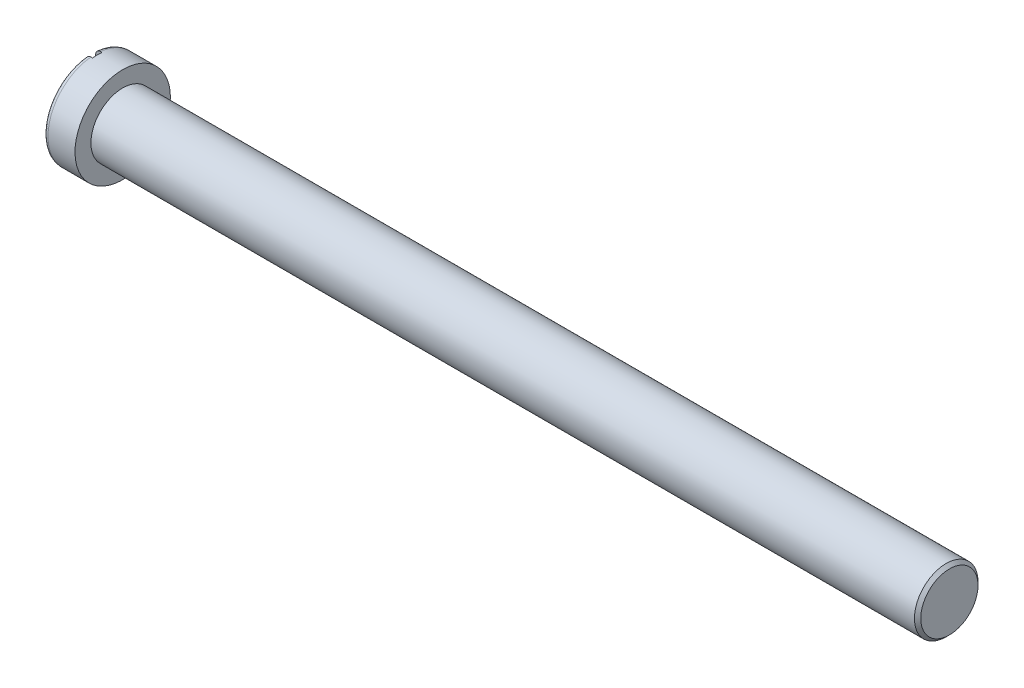
ISO-10303-21;
HEADER;
FILE_DESCRIPTION(('STEP AP214'),'2;1');
FILE_NAME('part.step','',(''),(''),'','','');
FILE_SCHEMA(('AUTOMOTIVE_DESIGN { 1 0 10303 214 1 1 1 1 }'));
ENDSEC;
DATA;
#1=APPLICATION_CONTEXT('core data for automotive mechanical design processes');
#2=APPLICATION_PROTOCOL_DEFINITION('international standard','automotive_design',2000,#1);
#3=PRODUCT_CONTEXT('',#1,'mechanical');
#4=PRODUCT('Part','Part','',(#3));
#5=PRODUCT_RELATED_PRODUCT_CATEGORY('part','',(#4));
#6=PRODUCT_DEFINITION_FORMATION('','',#4);
#7=PRODUCT_DEFINITION_CONTEXT('part definition',#1,'design');
#8=PRODUCT_DEFINITION('design','',#6,#7);
#9=PRODUCT_DEFINITION_SHAPE('','',#8);
#10=(LENGTH_UNIT() NAMED_UNIT(*) SI_UNIT(.MILLI.,.METRE.));
#11=(NAMED_UNIT(*) PLANE_ANGLE_UNIT() SI_UNIT($,.RADIAN.));
#12=(NAMED_UNIT(*) SI_UNIT($,.STERADIAN.) SOLID_ANGLE_UNIT());
#13=UNCERTAINTY_MEASURE_WITH_UNIT(LENGTH_MEASURE(1.E-05),#10,'distance_accuracy_value','');
#14=(GEOMETRIC_REPRESENTATION_CONTEXT(3) GLOBAL_UNCERTAINTY_ASSIGNED_CONTEXT((#13)) GLOBAL_UNIT_ASSIGNED_CONTEXT((#10,
#11,#12)) REPRESENTATION_CONTEXT('',''));
#15=CARTESIAN_POINT('',(0.,0.,0.));
#16=DIRECTION('',(0.,0.,1.));
#17=DIRECTION('',(1.,0.,0.));
#18=AXIS2_PLACEMENT_3D('',#15,#16,#17);
#19=CARTESIAN_POINT('',(0.,0.,0.));
#20=DIRECTION('',(1.,0.,0.));
#21=DIRECTION('',(0.,0.,-1.));
#22=AXIS2_PLACEMENT_3D('',#19,#20,#21);
#23=PLANE('',#22);
#24=CARTESIAN_POINT('',(0.,0.,0.));
#25=DIRECTION('',(1.,0.,0.));
#26=DIRECTION('',(0.,0.,-1.));
#27=AXIS2_PLACEMENT_3D('',#24,#25,#26);
#28=CIRCLE('',#27,13.5);
#29=CARTESIAN_POINT('',(0.,-13.4164078649987,1.5));
#30=VERTEX_POINT('',#29);
#31=CARTESIAN_POINT('',(0.,13.4164078649987,1.5));
#32=VERTEX_POINT('',#31);
#33=EDGE_CURVE('E100',#30,#32,#28,.F.);
#34=ORIENTED_EDGE('',*,*,#33,.T.);
#35=DIRECTION('',(0.,1.,0.));
#36=VECTOR('',#35,1.);
#37=CARTESIAN_POINT('',(0.,16.2746673821269,1.5));
#38=LINE('',#37,#36);
#39=EDGE_CURVE('E91',#30,#32,#38,.T.);
#40=ORIENTED_EDGE('',*,*,#39,.F.);
#41=EDGE_LOOP('',(#34,#40));
#42=FACE_BOUND('',#41,.T.);
#43=ADVANCED_FACE('F36',(#42),#23,.F.);
#44=CARTESIAN_POINT('',(1.5,0.,0.));
#45=DIRECTION('',(1.,0.,0.));
#46=DIRECTION('',(0.,0.,-1.));
#47=AXIS2_PLACEMENT_3D('',#44,#45,#46);
#48=TOROIDAL_SURFACE('',#47,13.5,1.5);
#49=CARTESIAN_POINT('',(0.658761657110633,-14.6653893429134,1.5));
#50=CARTESIAN_POINT('',(0.588881950075341,-14.6178026250305,1.5));
#51=CARTESIAN_POINT('',(0.522984597750688,-14.5642549943853,1.5));
#52=CARTESIAN_POINT('',(0.401076928482061,-14.446795651112,1.5));
#53=CARTESIAN_POINT('',(0.345079184117682,-14.3828709542763,1.5));
#54=CARTESIAN_POINT('',(0.244632342060913,-14.246577084176,1.5));
#55=CARTESIAN_POINT('',(0.200175115110685,-14.17421390742,1.5));
#56=CARTESIAN_POINT('',(0.12399887001359,-14.0230949355003,1.5));
#57=CARTESIAN_POINT('',(0.0922767156007468,-13.9443407200079,1.5));
#58=CARTESIAN_POINT('',(0.0423104345262116,-13.7823199551055,1.5));
#59=CARTESIAN_POINT('',(0.024120943644333,-13.6990365553484,1.5));
#60=CARTESIAN_POINT('',(0.00191683853748084,-13.5305974576376,1.5));
#61=CARTESIAN_POINT('',(-0.00209682620864541,-13.4454416346557,1.5));
#62=CARTESIAN_POINT('',(0.00416504746139457,-13.2752987289487,1.5));
#63=CARTESIAN_POINT('',(0.0145004920128933,-13.1903138460268,1.5));
#64=CARTESIAN_POINT('',(0.0492760978027703,-13.0232795750513,1.5));
#65=CARTESIAN_POINT('',(0.0737164198633457,-12.9412302204797,1.5));
#66=CARTESIAN_POINT('',(0.13605769342508,-12.7823167671011,1.5));
#67=CARTESIAN_POINT('',(0.173972331562082,-12.7054580355235,1.5));
#68=CARTESIAN_POINT('',(0.262207220655774,-12.5592242512426,1.5));
#69=CARTESIAN_POINT('',(0.312527308092724,-12.4898490999134,1.5));
#70=CARTESIAN_POINT('',(0.423984319588116,-12.3608106529017,1.5));
#71=CARTESIAN_POINT('',(0.485085138625724,-12.3011161785888,1.5));
#72=CARTESIAN_POINT('',(0.616500240274044,-12.1929155651438,1.5));
#73=CARTESIAN_POINT('',(0.686814205614405,-12.1444090408943,1.5));
#74=CARTESIAN_POINT('',(0.834160640461374,-12.0603116375499,1.5));
#75=CARTESIAN_POINT('',(0.911145182611494,-12.0246367903474,1.5));
#76=CARTESIAN_POINT('',(1.07003843685694,-11.9668200197288,1.5));
#77=CARTESIAN_POINT('',(1.15194693709275,-11.9446775145238,1.5));
#78=CARTESIAN_POINT('',(1.31776100635549,-11.9146971500425,1.5));
#79=CARTESIAN_POINT('',(1.40164907215188,-11.9067624329036,1.5));
#80=CARTESIAN_POINT('',(1.56956190315916,-11.9051385965254,1.5));
#81=CARTESIAN_POINT('',(1.65358666499348,-11.9114491305905,1.5));
#82=CARTESIAN_POINT('',(1.81911202649103,-11.9380831725712,1.5));
#83=CARTESIAN_POINT('',(1.90061972383106,-11.9583626157128,1.5));
#84=CARTESIAN_POINT('',(2.05908617805528,-12.0122852588638,1.5));
#85=CARTESIAN_POINT('',(2.13604490335928,-12.0459285516361,1.5));
#86=CARTESIAN_POINT('',(2.28344255560767,-12.1256886135582,1.5));
#87=CARTESIAN_POINT('',(2.35386513049815,-12.1718355919212,1.5));
#88=CARTESIAN_POINT('',(2.48602837520643,-12.2752257981684,1.5));
#89=CARTESIAN_POINT('',(2.54776876583923,-12.3324693827353,1.5));
#90=CARTESIAN_POINT('',(2.66124847585957,-12.456822263191,1.5));
#91=CARTESIAN_POINT('',(2.7129200476245,-12.5239933792009,1.5));
#92=CARTESIAN_POINT('',(2.80434502440279,-12.6660078407253,1.5));
#93=CARTESIAN_POINT('',(2.84409797148056,-12.7408514808839,1.5));
#94=CARTESIAN_POINT('',(2.91083598100987,-12.8966440789083,1.5));
#95=CARTESIAN_POINT('',(2.9377309367866,-12.9776316442004,1.5));
#96=CARTESIAN_POINT('',(2.97760323050339,-13.1429638178419,1.5));
#97=CARTESIAN_POINT('',(2.9905801985925,-13.2273085153407,1.5));
#98=CARTESIAN_POINT('',(3.00227734204711,-13.3973172008241,1.5));
#99=CARTESIAN_POINT('',(3.00094101353135,-13.4829850834303,1.5));
#100=CARTESIAN_POINT('',(2.98390101056976,-13.6528808119779,1.5));
#101=CARTESIAN_POINT('',(2.96819729524074,-13.737108653821,1.5));
#102=CARTESIAN_POINT('',(2.92285271426361,-13.9016963670216,1.5));
#103=CARTESIAN_POINT('',(2.89321655149946,-13.9820575334893,1.5));
#104=CARTESIAN_POINT('',(2.82082268209457,-14.1366360146808,1.5));
#105=CARTESIAN_POINT('',(2.77806516980442,-14.2108534203839,1.5));
#106=CARTESIAN_POINT('',(2.68080843369073,-14.350727659402,1.5));
#107=CARTESIAN_POINT('',(2.62635472039642,-14.4164161331203,1.5));
#108=CARTESIAN_POINT('',(2.5071383499482,-14.5376575848534,1.5));
#109=CARTESIAN_POINT('',(2.44237596014139,-14.5932108256372,1.5));
#110=CARTESIAN_POINT('',(2.30474919481204,-14.6922912743553,1.5));
#111=CARTESIAN_POINT('',(2.23192961851644,-14.7358807112105,1.5));
#112=CARTESIAN_POINT('',(2.07998240725951,-14.810146311361,1.5));
#113=CARTESIAN_POINT('',(2.00085519646259,-14.8408233420967,1.5));
#114=CARTESIAN_POINT('',(1.8389477949111,-14.8882505601209,1.5));
#115=CARTESIAN_POINT('',(1.75618707464182,-14.9050672386618,1.5));
#116=CARTESIAN_POINT('',(1.58899314558215,-14.9245310375368,1.5));
#117=CARTESIAN_POINT('',(1.50455955115278,-14.9271748516142,1.5));
#118=CARTESIAN_POINT('',(1.3366357807586,-14.9182209694009,1.5));
#119=CARTESIAN_POINT('',(1.25314401142346,-14.9066527964598,1.5));
#120=CARTESIAN_POINT('',(1.08936107345172,-14.8696654279596,1.5));
#121=CARTESIAN_POINT('',(1.00906612969114,-14.844263123138,1.5));
#122=CARTESIAN_POINT('',(0.883668167759655,-14.7926519647947,1.5));
#123=CARTESIAN_POINT('',(0.83686302706175,-14.7704767176594,1.5));
#124=CARTESIAN_POINT('',(0.745795187066769,-14.7214084521374,1.5));
#125=CARTESIAN_POINT('',(0.701532483496852,-14.6945154416796,1.5));
#126=CARTESIAN_POINT('',(0.658761657110633,-14.6653893429134,1.5));
#127=B_SPLINE_CURVE_WITH_KNOTS('',3,(#49,#50,#51,#52,#53,#54,#55,#56,#57,#58,#59,#60,#61,#62,
#63,#64,#65,#66,#67,#68,#69,#70,#71,#72,#73,#74,#75,#76,#77,#78,#79,#80,#81,#82,#83,#84,#85,#86,
#87,#88,#89,#90,#91,#92,#93,#94,#95,#96,#97,#98,#99,#100,#101,#102,#103,#104,#105,#106,#107,
#108,#109,#110,#111,#112,#113,#114,#115,#116,#117,#118,#119,#120,#121,#122,#123,#124,#125,#126),
.UNSPECIFIED.,.T.,.F.,(4,2,2,2,2,2,2,2,2,2,2,2,2,2,2,2,2,2,2,2,2,2,2,2,2,2,2,2,2,2,2,2,2,2,2,2,
2,2,4),(0.,0.253441528559013,0.507202653017029,0.76078453750335,1.01430393402001,
1.26884139792486,1.52339591010279,1.77901636426818,2.03463973304627,2.29052349878496,
2.54640389182759,2.80144305906708,3.05647344590647,3.30980322165966,3.56312210536949,
3.81470738268159,4.06628653706881,4.31707570038572,4.56786660454331,4.81926891345916,
5.07067930463989,5.32372693786954,5.57678429241107,5.83158994005511,6.08640235863292,
6.34222105693691,6.59804048318961,6.85377361977961,7.10950296868849,7.36425472678598,
7.61899987918088,7.87239373656145,8.12577056852079,8.37792470087382,8.63013765337704,
8.88182755468883,9.13321084274947,9.28833344264498,9.44345578183254),.UNSPECIFIED.);
#128=CARTESIAN_POINT('',(1.5,-14.9248115565993,1.5));
#129=VERTEX_POINT('',#128);
#130=EDGE_CURVE('E88',#129,#30,#127,.T.);
#131=ORIENTED_EDGE('',*,*,#130,.F.);
#132=CARTESIAN_POINT('',(1.5,0.,0.));
#133=DIRECTION('',(1.,0.,0.));
#134=DIRECTION('',(0.,0.,-1.));
#135=AXIS2_PLACEMENT_3D('',#132,#133,#134);
#136=CIRCLE('',#135,15.);
#137=CARTESIAN_POINT('',(1.5,14.9248115565993,1.5));
#138=VERTEX_POINT('',#137);
#139=EDGE_CURVE('E110',#138,#129,#136,.T.);
#140=ORIENTED_EDGE('',*,*,#139,.F.);
#141=CARTESIAN_POINT('',(0.89208507766852,12.0355962922635,1.5));
#142=CARTESIAN_POINT('',(0.815014890465412,12.0700313096894,1.5));
#143=CARTESIAN_POINT('',(0.740810542502947,12.1110372439416,1.5));
#144=CARTESIAN_POINT('',(0.600295645227888,12.2049842717177,1.5));
#145=CARTESIAN_POINT('',(0.533995327214941,12.257940583346,1.5));
#146=CARTESIAN_POINT('',(0.411256492018765,12.3741776563161,1.5));
#147=CARTESIAN_POINT('',(0.354810250281672,12.4374502548437,1.5));
#148=CARTESIAN_POINT('',(0.253291482478019,12.5725120915492,1.5));
#149=CARTESIAN_POINT('',(0.20821617909033,12.6442992437605,1.5));
#150=CARTESIAN_POINT('',(0.1304378187704,12.7947747980929,1.5));
#151=CARTESIAN_POINT('',(0.0978018332667412,12.8734978713372,1.5));
#152=CARTESIAN_POINT('',(0.0461361819431869,13.0352929426433,1.5));
#153=CARTESIAN_POINT('',(0.0271074653083362,13.1183652436551,1.5));
#154=CARTESIAN_POINT('',(0.00312600371542954,13.2869232678526,1.5));
#155=CARTESIAN_POINT('',(-0.00175917646988912,13.3724186117245,1.5));
#156=CARTESIAN_POINT('',(0.00288308461369389,13.5430179649898,1.5));
#157=CARTESIAN_POINT('',(0.01241063191892,13.6281219714994,1.5));
#158=CARTESIAN_POINT('',(0.0456370896693509,13.7955705240068,1.5));
#159=CARTESIAN_POINT('',(0.0693442746278495,13.8779134291139,1.5));
#160=CARTESIAN_POINT('',(0.13029033402662,14.0374302350894,1.5));
#161=CARTESIAN_POINT('',(0.167529006826756,14.1146042129625,1.5));
#162=CARTESIAN_POINT('',(0.254364534386661,14.2613201550759,1.5));
#163=CARTESIAN_POINT('',(0.303921288605928,14.3308858495336,1.5));
#164=CARTESIAN_POINT('',(0.414066989789804,14.460654493929,1.5));
#165=CARTESIAN_POINT('',(0.474655657716305,14.5208576806079,1.5));
#166=CARTESIAN_POINT('',(0.604809592743308,14.6298580262961,1.5));
#167=CARTESIAN_POINT('',(0.6743266711274,14.6787127251941,1.5));
#168=CARTESIAN_POINT('',(0.820609294130074,14.7639885935677,1.5));
#169=CARTESIAN_POINT('',(0.897374628707282,14.8004101231931,1.5));
#170=CARTESIAN_POINT('',(1.05556051447166,14.8596005647775,1.5));
#171=CARTESIAN_POINT('',(1.13695583040908,14.8824369273736,1.5));
#172=CARTESIAN_POINT('',(1.30242981081702,14.9140726044092,1.5));
#173=CARTESIAN_POINT('',(1.38650842022669,14.9228722066927,1.5));
#174=CARTESIAN_POINT('',(1.55468259415372,14.9261715420581,1.5));
#175=CARTESIAN_POINT('',(1.63877728995691,14.9207157355694,1.5));
#176=CARTESIAN_POINT('',(1.80485509279348,14.8957581040442,1.5));
#177=CARTESIAN_POINT('',(1.88683821389806,14.8762563726325,1.5));
#178=CARTESIAN_POINT('',(2.04634628194513,14.8237825486784,1.5));
#179=CARTESIAN_POINT('',(2.12387250775984,14.7908143424686,1.5));
#180=CARTESIAN_POINT('',(2.27230936595073,14.7123628899572,1.5));
#181=CARTESIAN_POINT('',(2.34321993748057,14.6668795285648,1.5));
#182=CARTESIAN_POINT('',(2.47661836343001,14.5645723101346,1.5));
#183=CARTESIAN_POINT('',(2.53908377157139,14.5077191895758,1.5));
#184=CARTESIAN_POINT('',(2.65363791460733,14.3843769269927,1.5));
#185=CARTESIAN_POINT('',(2.70572641810588,14.3178875701458,1.5));
#186=CARTESIAN_POINT('',(2.79831500036371,14.1768272210736,1.5));
#187=CARTESIAN_POINT('',(2.83875915613995,14.1022195245961,1.5));
#188=CARTESIAN_POINT('',(2.90662354584902,13.9472993133364,1.5));
#189=CARTESIAN_POINT('',(2.93404339415309,13.8669866297197,1.5));
#190=CARTESIAN_POINT('',(2.97522934471961,13.7024802387243,1.5));
#191=CARTESIAN_POINT('',(2.98892228595146,13.6182682122645,1.5));
#192=CARTESIAN_POINT('',(3.00203496590845,13.4487398365099,1.5));
#193=CARTESIAN_POINT('',(3.00145435298929,13.36342346006,1.5));
#194=CARTESIAN_POINT('',(2.98601546613215,13.1937625958926,1.5));
#195=CARTESIAN_POINT('',(2.97110267577383,13.1094230639667,1.5));
#196=CARTESIAN_POINT('',(2.92733589042015,12.9444408641098,1.5));
#197=CARTESIAN_POINT('',(2.89848173149701,12.8637982396608,1.5));
#198=CARTESIAN_POINT('',(2.82761727755424,12.7084798177426,1.5));
#199=CARTESIAN_POINT('',(2.78560226706869,12.6338061709836,1.5));
#200=CARTESIAN_POINT('',(2.68958496836344,12.4926083755097,1.5));
#201=CARTESIAN_POINT('',(2.6355828446111,12.4260841150019,1.5));
#202=CARTESIAN_POINT('',(2.51733736031599,12.3033686390123,1.5));
#203=CARTESIAN_POINT('',(2.45313516964805,12.2471377614144,1.5));
#204=CARTESIAN_POINT('',(2.3161475991454,12.1463453798731,1.5));
#205=CARTESIAN_POINT('',(2.24336288767837,12.101782968112,1.5));
#206=CARTESIAN_POINT('',(2.09182412514201,12.0259259760693,1.5));
#207=CARTESIAN_POINT('',(2.01311587655249,11.9945398898946,1.5));
#208=CARTESIAN_POINT('',(1.85150423817229,11.9455181819008,1.5));
#209=CARTESIAN_POINT('',(1.7685999662169,11.9278854644609,1.5));
#210=CARTESIAN_POINT('',(1.60151607307423,11.906975824647,1.5));
#211=CARTESIAN_POINT('',(1.51734710836448,11.903613278783,1.5));
#212=CARTESIAN_POINT('',(1.34971773810008,11.9111185472319,1.5));
#213=CARTESIAN_POINT('',(1.26625658271372,11.9219687029521,1.5));
#214=CARTESIAN_POINT('',(1.13415430880914,11.9506202557316,1.5));
#215=CARTESIAN_POINT('',(1.08453665976437,11.9641070570045,1.5));
#216=CARTESIAN_POINT('',(0.986953893342505,11.9961167846054,1.5));
#217=CARTESIAN_POINT('',(0.938988768458397,12.0146396880524,1.5));
#218=CARTESIAN_POINT('',(0.89208507766852,12.0355962922635,1.5));
#219=B_SPLINE_CURVE_WITH_KNOTS('',3,(#141,#142,#143,#144,#145,#146,#147,#148,#149,#150,#151,
#152,#153,#154,#155,#156,#157,#158,#159,#160,#161,#162,#163,#164,#165,#166,#167,#168,#169,#170,
#171,#172,#173,#174,#175,#176,#177,#178,#179,#180,#181,#182,#183,#184,#185,#186,#187,#188,#189,
#190,#191,#192,#193,#194,#195,#196,#197,#198,#199,#200,#201,#202,#203,#204,#205,#206,#207,#208,
#209,#210,#211,#212,#213,#214,#215,#216,#217,#218),.UNSPECIFIED.,.T.,.F.,(4,2,2,2,2,2,2,2,2,2,2,
2,2,2,2,2,2,2,2,2,2,2,2,2,2,2,2,2,2,2,2,2,2,2,2,2,2,2,4),(0.,0.253050279831795,
0.506424641229036,0.759599483241509,1.01271242797655,1.26717144786768,1.52164821600382,
1.77733864965234,2.03303096445802,2.28887263403146,2.54471049132394,2.79972615325299,
3.05473536578377,3.308421926232,3.56210113755671,3.81451008028083,4.06691384693102,
4.31853134534887,4.57014716659504,4.82169042448002,5.07323599566314,5.3254375268068,
5.57764468119764,5.83104361392887,6.08445004892664,6.33920000966349,6.59395624644505,
6.84968537054,7.10541750166567,7.36124136531709,7.6170617191932,7.87187459428824,
8.12666763880503,8.37966071235323,8.6327071974736,8.88423319423356,9.1354469783574,
9.28945005575316,9.44345243345913),.UNSPECIFIED.);
#220=EDGE_CURVE('E97',#32,#138,#219,.T.);
#221=ORIENTED_EDGE('',*,*,#220,.F.);
#222=ORIENTED_EDGE('',*,*,#33,.F.);
#223=EDGE_LOOP('',(#131,#140,#221,#222));
#224=FACE_BOUND('',#223,.T.);
#225=ADVANCED_FACE('F103',(#224),#48,.T.);
#226=CARTESIAN_POINT('',(10.,0.,0.));
#227=DIRECTION('',(1.,0.,0.));
#228=DIRECTION('',(0.,0.,-1.));
#229=AXIS2_PLACEMENT_3D('',#226,#227,#228);
#230=PLANE('',#229);
#231=CARTESIAN_POINT('',(10.,0.,0.));
#232=DIRECTION('',(1.,0.,0.));
#233=DIRECTION('',(0.,0.,-1.));
#234=AXIS2_PLACEMENT_3D('',#231,#232,#233);
#235=CIRCLE('',#234,15.);
#236=CARTESIAN_POINT('',(10.,0.,-15.));
#237=VERTEX_POINT('',#236);
#238=EDGE_CURVE('E165',#237,#237,#235,.T.);
#239=ORIENTED_EDGE('',*,*,#238,.T.);
#240=EDGE_LOOP('',(#239));
#241=FACE_BOUND('',#240,.T.);
#242=CARTESIAN_POINT('',(10.,0.,0.));
#243=DIRECTION('',(1.,0.,0.));
#244=DIRECTION('',(0.,0.,-1.));
#245=AXIS2_PLACEMENT_3D('',#242,#243,#244);
#246=CIRCLE('',#245,10.);
#247=CARTESIAN_POINT('',(10.,0.,-10.));
#248=VERTEX_POINT('',#247);
#249=EDGE_CURVE('E170',#248,#248,#246,.T.);
#250=ORIENTED_EDGE('',*,*,#249,.F.);
#251=EDGE_LOOP('',(#250));
#252=FACE_BOUND('',#251,.T.);
#253=ADVANCED_FACE('F193',(#241,#252),#230,.T.);
#254=CARTESIAN_POINT('',(0.,13.4164078649987,-1.5));
#255=VERTEX_POINT('',#254);
#256=CARTESIAN_POINT('',(0.,-13.4164078649987,-1.5));
#257=VERTEX_POINT('',#256);
#258=EDGE_CURVE('E105',#255,#257,#28,.F.);
#259=ORIENTED_EDGE('',*,*,#258,.T.);
#260=DIRECTION('',(0.,-1.,0.));
#261=VECTOR('',#260,1.);
#262=CARTESIAN_POINT('',(0.,16.2746673821269,-1.5));
#263=LINE('',#262,#261);
#264=EDGE_CURVE('E101',#255,#257,#263,.T.);
#265=ORIENTED_EDGE('',*,*,#264,.F.);
#266=EDGE_LOOP('',(#259,#265));
#267=FACE_BOUND('',#266,.T.);
#268=ADVANCED_FACE('F189',(#267),#23,.F.);
#269=CARTESIAN_POINT('',(10.,0.,0.));
#270=DIRECTION('',(-1.,0.,0.));
#271=DIRECTION('',(0.,0.,1.));
#272=AXIS2_PLACEMENT_3D('',#269,#270,#271);
#273=CYLINDRICAL_SURFACE('',#272,15.);
#274=CARTESIAN_POINT('',(2.,0.,0.));
#275=DIRECTION('',(-1.,0.,0.));
#276=DIRECTION('',(0.,0.,1.));
#277=AXIS2_PLACEMENT_3D('',#274,#275,#276);
#278=CIRCLE('',#277,15.);
#279=CARTESIAN_POINT('',(2.,14.9248115565993,1.5));
#280=VERTEX_POINT('',#279);
#281=CARTESIAN_POINT('',(2.,14.9248115565993,-1.5));
#282=VERTEX_POINT('',#281);
#283=EDGE_CURVE('E11',#280,#282,#278,.T.);
#284=ORIENTED_EDGE('',*,*,#283,.F.);
#285=DIRECTION('',(-1.,0.,0.));
#286=VECTOR('',#285,1.);
#287=CARTESIAN_POINT('',(10.,14.9248115565993,1.5));
#288=LINE('',#287,#286);
#289=EDGE_CURVE('E157',#280,#138,#288,.T.);
#290=ORIENTED_EDGE('',*,*,#289,.T.);
#291=ORIENTED_EDGE('',*,*,#139,.T.);
#292=DIRECTION('',(-1.,0.,0.));
#293=VECTOR('',#292,1.);
#294=CARTESIAN_POINT('',(10.,-14.9248115565993,1.5));
#295=LINE('',#294,#293);
#296=CARTESIAN_POINT('',(2.,-14.9248115565993,1.5));
#297=VERTEX_POINT('',#296);
#298=EDGE_CURVE('E60',#129,#297,#295,.F.);
#299=ORIENTED_EDGE('',*,*,#298,.T.);
#300=CARTESIAN_POINT('',(2.,-14.9248115565993,-1.5));
#301=VERTEX_POINT('',#300);
#302=EDGE_CURVE('E41',#301,#297,#278,.T.);
#303=ORIENTED_EDGE('',*,*,#302,.F.);
#304=DIRECTION('',(-1.,0.,0.));
#305=VECTOR('',#304,1.);
#306=CARTESIAN_POINT('',(10.,-14.9248115565993,-1.5));
#307=LINE('',#306,#305);
#308=CARTESIAN_POINT('',(1.50000000000003,-14.9248115565996,-1.5));
#309=VERTEX_POINT('',#308);
#310=EDGE_CURVE('E145',#301,#309,#307,.T.);
#311=ORIENTED_EDGE('',*,*,#310,.T.);
#312=CARTESIAN_POINT('',(1.5,14.9248115565993,-1.5));
#313=VERTEX_POINT('',#312);
#314=EDGE_CURVE('E112',#309,#313,#136,.T.);
#315=ORIENTED_EDGE('',*,*,#314,.T.);
#316=DIRECTION('',(-1.,0.,0.));
#317=VECTOR('',#316,1.);
#318=CARTESIAN_POINT('',(10.,14.9248115565993,-1.5));
#319=LINE('',#318,#317);
#320=EDGE_CURVE('E52',#313,#282,#319,.F.);
#321=ORIENTED_EDGE('',*,*,#320,.T.);
#322=EDGE_LOOP('',(#284,#290,#291,#299,#303,#311,#315,#321));
#323=FACE_BOUND('',#322,.T.);
#324=ORIENTED_EDGE('',*,*,#238,.F.);
#325=EDGE_LOOP('',(#324));
#326=FACE_BOUND('',#325,.T.);
#327=ADVANCED_FACE('F155',(#323,#326),#273,.T.);
#328=CARTESIAN_POINT('',(270.,0.,0.));
#329=DIRECTION('',(-1.,0.,0.));
#330=DIRECTION('',(0.,0.,1.));
#331=AXIS2_PLACEMENT_3D('',#328,#329,#330);
#332=CYLINDRICAL_SURFACE('',#331,10.);
#333=CARTESIAN_POINT('',(269.,0.,0.));
#334=DIRECTION('',(1.,0.,0.));
#335=DIRECTION('',(0.,0.,-1.));
#336=AXIS2_PLACEMENT_3D('',#333,#334,#335);
#337=CIRCLE('',#336,10.);
#338=CARTESIAN_POINT('',(269.,0.,-10.));
#339=VERTEX_POINT('',#338);
#340=EDGE_CURVE('E159',#339,#339,#337,.F.);
#341=ORIENTED_EDGE('',*,*,#340,.T.);
#342=EDGE_LOOP('',(#341));
#343=FACE_BOUND('',#342,.T.);
#344=ORIENTED_EDGE('',*,*,#249,.T.);
#345=EDGE_LOOP('',(#344));
#346=FACE_BOUND('',#345,.T.);
#347=ADVANCED_FACE('F202',(#343,#346),#332,.T.);
#348=CARTESIAN_POINT('',(270.,0.,0.));
#349=DIRECTION('',(1.,0.,0.));
#350=DIRECTION('',(0.,0.,-1.));
#351=AXIS2_PLACEMENT_3D('',#348,#349,#350);
#352=PLANE('',#351);
#353=CARTESIAN_POINT('',(270.,0.,0.));
#354=DIRECTION('',(1.,0.,0.));
#355=DIRECTION('',(0.,0.,-1.));
#356=AXIS2_PLACEMENT_3D('',#353,#354,#355);
#357=CIRCLE('',#356,9.00000000000004);
#358=CARTESIAN_POINT('',(270.,0.,-9.00000000000004));
#359=VERTEX_POINT('',#358);
#360=EDGE_CURVE('E161',#359,#359,#357,.T.);
#361=ORIENTED_EDGE('',*,*,#360,.T.);
#362=EDGE_LOOP('',(#361));
#363=FACE_BOUND('',#362,.T.);
#364=ADVANCED_FACE('F133',(#363),#352,.T.);
#365=CARTESIAN_POINT('',(270.,0.,0.));
#366=DIRECTION('',(-1.,0.,0.));
#367=DIRECTION('',(0.,0.,1.));
#368=AXIS2_PLACEMENT_3D('',#365,#366,#367);
#369=CONICAL_SURFACE('',#368,9.00000000000004,0.785398163397457);
#370=ORIENTED_EDGE('',*,*,#340,.F.);
#371=EDGE_LOOP('',(#370));
#372=FACE_BOUND('',#371,.T.);
#373=ORIENTED_EDGE('',*,*,#360,.F.);
#374=EDGE_LOOP('',(#373));
#375=FACE_BOUND('',#374,.T.);
#376=ADVANCED_FACE('F186',(#372,#375),#369,.T.);
#377=CARTESIAN_POINT('',(0.658761657110633,-14.6653893429134,-1.5));
#378=CARTESIAN_POINT('',(0.728182612333866,-14.7126545686782,-1.5));
#379=CARTESIAN_POINT('',(0.801633616699796,-14.7541063271724,-1.5));
#380=CARTESIAN_POINT('',(0.95450992112953,-14.8241296085134,-1.5));
#381=CARTESIAN_POINT('',(1.03394199295145,-14.852686267718,-1.5));
#382=CARTESIAN_POINT('',(1.19645554272504,-14.8960348644231,-1.5));
#383=CARTESIAN_POINT('',(1.2795357125672,-14.9108316942952,-1.5));
#384=CARTESIAN_POINT('',(1.44697955597956,-14.9262368051794,-1.5));
#385=CARTESIAN_POINT('',(1.53134291470202,-14.9268485122505,-1.5));
#386=CARTESIAN_POINT('',(1.69884351816471,-14.9138860344255,-1.5));
#387=CARTESIAN_POINT('',(1.78198242936241,-14.9003333767029,-1.5));
#388=CARTESIAN_POINT('',(1.94480935027493,-14.8594693103717,-1.5));
#389=CARTESIAN_POINT('',(2.02449723972117,-14.8321574226704,-1.5));
#390=CARTESIAN_POINT('',(2.17821154602586,-14.7645487945332,-1.5));
#391=CARTESIAN_POINT('',(2.25223479209722,-14.7242448466257,-1.5));
#392=CARTESIAN_POINT('',(2.39249347725377,-14.6318207387521,-1.5));
#393=CARTESIAN_POINT('',(2.45872882609387,-14.5797004418804,-1.5));
#394=CARTESIAN_POINT('',(2.58177520276955,-14.4649455066233,-1.5));
#395=CARTESIAN_POINT('',(2.63855409292483,-14.4022764126055,-1.5));
#396=CARTESIAN_POINT('',(2.7408481208929,-14.2683369742094,-1.5));
#397=CARTESIAN_POINT('',(2.78636299430297,-14.1970664279858,-1.5));
#398=CARTESIAN_POINT('',(2.86508538896021,-14.0475614238874,-1.5));
#399=CARTESIAN_POINT('',(2.89822923742965,-13.969293439888,-1.5));
#400=CARTESIAN_POINT('',(2.95098179355573,-13.8083219659509,-1.5));
#401=CARTESIAN_POINT('',(2.97059008973166,-13.725618341252,-1.5));
#402=CARTESIAN_POINT('',(2.99581130672622,-13.5576719699901,-1.5));
#403=CARTESIAN_POINT('',(3.00135236517634,-13.4724184279006,-1.5));
#404=CARTESIAN_POINT('',(2.99808980364415,-13.3021856166829,-1.5));
#405=CARTESIAN_POINT('',(2.98928586707053,-13.2172063536494,-1.5));
#406=CARTESIAN_POINT('',(2.95753396382054,-13.0496665542603,-1.5));
#407=CARTESIAN_POINT('',(2.93454359373947,-12.967114049405,-1.5));
#408=CARTESIAN_POINT('',(2.87501890467857,-12.8070440342816,-1.5));
#409=CARTESIAN_POINT('',(2.83848454063642,-12.7295265407665,-1.5));
#410=CARTESIAN_POINT('',(2.75292112515002,-12.5818127124642,-1.5));
#411=CARTESIAN_POINT('',(2.70390295960246,-12.5116100738856,-1.5));
#412=CARTESIAN_POINT('',(2.59472091269299,-12.3804832977423,-1.5));
#413=CARTESIAN_POINT('',(2.53455728945592,-12.3195589453553,-1.5));
#414=CARTESIAN_POINT('',(2.40510761138686,-12.2090606403558,-1.5));
#415=CARTESIAN_POINT('',(2.33586927958902,-12.1594307890967,-1.5));
#416=CARTESIAN_POINT('',(2.18999400977436,-12.0725993764953,-1.5));
#417=CARTESIAN_POINT('',(2.11335738028437,-12.0353972971734,-1.5));
#418=CARTESIAN_POINT('',(1.95545621971932,-11.9747600125788,-1.5));
#419=CARTESIAN_POINT('',(1.87422922080818,-11.9512270643212,-1.5));
#420=CARTESIAN_POINT('',(1.70896805030203,-11.918218518271,-1.5));
#421=CARTESIAN_POINT('',(1.62493398387451,-11.9087423944385,-1.5));
#422=CARTESIAN_POINT('',(1.45694766499189,-11.9041458454864,-1.5));
#423=CARTESIAN_POINT('',(1.37299759621457,-11.908945217467,-1.5));
#424=CARTESIAN_POINT('',(1.20709879406508,-11.9325816109411,-1.5));
#425=CARTESIAN_POINT('',(1.12515003979088,-11.9514184857602,-1.5));
#426=CARTESIAN_POINT('',(0.965628613666492,-12.0025508568056,-1.5));
#427=CARTESIAN_POINT('',(0.888053010386335,-12.0348372127357,-1.5));
#428=CARTESIAN_POINT('',(0.73938832876451,-12.111917309394,-1.5));
#429=CARTESIAN_POINT('',(0.668299373441878,-12.1567112872634,-1.5));
#430=CARTESIAN_POINT('',(0.534263212617399,-12.2577423790329,-1.5));
#431=CARTESIAN_POINT('',(0.471355209032133,-12.3140314914596,-1.5));
#432=CARTESIAN_POINT('',(0.355798403660492,-12.4363045440895,-1.5));
#433=CARTESIAN_POINT('',(0.303150006030831,-12.5022888660367,-1.5));
#434=CARTESIAN_POINT('',(0.209207507579204,-12.6425874698038,-1.5));
#435=CARTESIAN_POINT('',(0.167997647374431,-12.7169581606794,-1.5));
#436=CARTESIAN_POINT('',(0.0985633623502163,-12.8715328443659,-1.5));
#437=CARTESIAN_POINT('',(0.0703394158753313,-12.9517370519321,-1.5));
#438=CARTESIAN_POINT('',(0.027521195574583,-13.1162134136214,-1.5));
#439=CARTESIAN_POINT('',(0.0130085844284075,-13.2005068359638,-1.5));
#440=CARTESIAN_POINT('',(-0.00169111991509037,-13.3703312924566,-1.5));
#441=CARTESIAN_POINT('',(-0.00187852869360686,-13.4558622993018,-1.5));
#442=CARTESIAN_POINT('',(0.0120996718681551,-13.6259125838862,-1.5));
#443=CARTESIAN_POINT('',(0.0262932814041554,-13.7104295624818,-1.5));
#444=CARTESIAN_POINT('',(0.0687031760901001,-13.8758944982739,-1.5));
#445=CARTESIAN_POINT('',(0.0969228468218066,-13.9568415886397,-1.5));
#446=CARTESIAN_POINT('',(0.166546443735814,-14.1126874021236,-1.5));
#447=CARTESIAN_POINT('',(0.20792901555061,-14.1875956770791,-1.5));
#448=CARTESIAN_POINT('',(0.302715690051941,-14.3292864259664,-1.5));
#449=CARTESIAN_POINT('',(0.35610499640316,-14.3960787467448,-1.5));
#450=CARTESIAN_POINT('',(0.451542932424792,-14.4966573850049,-1.5));
#451=CARTESIAN_POINT('',(0.490437471112795,-14.5334879934615,-1.5));
#452=CARTESIAN_POINT('',(0.57192982376516,-14.6027956088941,-1.5));
#453=CARTESIAN_POINT('',(0.614527629605254,-14.6352726254208,-1.5));
#454=CARTESIAN_POINT('',(0.658761657110633,-14.6653893429134,-1.5));
#455=B_SPLINE_CURVE_WITH_KNOTS('',3,(#377,#378,#379,#380,#381,#382,#383,#384,#385,#386,#387,
#388,#389,#390,#391,#392,#393,#394,#395,#396,#397,#398,#399,#400,#401,#402,#403,#404,#405,#406,
#407,#408,#409,#410,#411,#412,#413,#414,#415,#416,#417,#418,#419,#420,#421,#422,#423,#424,#425,
#426,#427,#428,#429,#430,#431,#432,#433,#434,#435,#436,#437,#438,#439,#440,#441,#442,#443,#444,
#445,#446,#447,#448,#449,#450,#451,#452,#453,#454),.UNSPECIFIED.,.T.,.F.,(4,2,2,2,2,2,2,2,2,2,2,
2,2,2,2,2,2,2,2,2,2,2,2,2,2,2,2,2,2,2,2,2,2,2,2,2,2,2,4),(0.,0.251756747078432,
0.503802947502629,0.755759497418384,1.00765519294229,1.25916861026862,1.51069078582933,
1.76235273659195,2.01401760329153,2.26652102964864,2.51903038251171,2.77282202519052,
3.02662138279422,3.28171468699482,3.53681362113247,3.79267876719873,4.04854476456334,
4.30418840573742,4.5598261270353,4.81416971398763,5.06850269877851,5.3209939116824,
5.57347567552572,5.82454162507464,6.07560495133125,6.32649793205414,6.57739566996461,
6.82945454230187,7.08152334198937,7.33540205008524,7.58929010921949,7.84468092875218,
8.10006612207723,8.35594951398329,8.61189470051269,8.86742676322614,9.12264563348083,
9.28306173938588,9.4434774933772),.UNSPECIFIED.);
#456=EDGE_CURVE('E107',#257,#309,#455,.T.);
#457=ORIENTED_EDGE('',*,*,#456,.F.);
#458=ORIENTED_EDGE('',*,*,#258,.F.);
#459=CARTESIAN_POINT('',(0.892085077668519,12.0355962922635,-1.5));
#460=CARTESIAN_POINT('',(0.968506673941052,12.0014593338734,-1.5));
#461=CARTESIAN_POINT('',(1.0478563083877,11.9737328173443,-1.5));
#462=CARTESIAN_POINT('',(1.21014746686126,11.931970602901,-1.5));
#463=CARTESIAN_POINT('',(1.29309295182645,11.9179504248181,-1.5));
#464=CARTESIAN_POINT('',(1.46013768795806,11.9040581201112,-1.5));
#465=CARTESIAN_POINT('',(1.54423650354517,11.9041807916898,-1.5));
#466=CARTESIAN_POINT('',(1.71119448546905,11.9185610325573,-1.5));
#467=CARTESIAN_POINT('',(1.79405393784726,11.9328152875794,-1.5));
#468=CARTESIAN_POINT('',(1.95613326317231,11.9750077843239,-1.5));
#469=CARTESIAN_POINT('',(2.03535626029542,12.0029340299402,-1.5));
#470=CARTESIAN_POINT('',(2.18801814441286,12.0716415763409,-1.5));
#471=CARTESIAN_POINT('',(2.26145673659136,12.1124235318176,-1.5));
#472=CARTESIAN_POINT('',(2.40077753319431,12.2058349471095,-1.5));
#473=CARTESIAN_POINT('',(2.46662948619239,12.2585095158404,-1.5));
#474=CARTESIAN_POINT('',(2.58863309947584,12.3740959625683,-1.5));
#475=CARTESIAN_POINT('',(2.64478442590783,12.4370081927564,-1.5));
#476=CARTESIAN_POINT('',(2.74621358308078,12.5717569627644,-1.5));
#477=CARTESIAN_POINT('',(2.79141218854682,12.643653137886,-1.5));
#478=CARTESIAN_POINT('',(2.86918672736926,12.7939760420243,-1.5));
#479=CARTESIAN_POINT('',(2.901762219328,12.8724029992891,-1.5));
#480=CARTESIAN_POINT('',(2.9535675842484,13.0340978773123,-1.5));
#481=CARTESIAN_POINT('',(2.97271147949945,13.1173933533211,-1.5));
#482=CARTESIAN_POINT('',(2.99678708638501,13.2860143437701,-1.5));
#483=CARTESIAN_POINT('',(3.0017184943283,13.3713399015496,-1.5));
#484=CARTESIAN_POINT('',(2.99721791830166,13.5418497280022,-1.5));
#485=CARTESIAN_POINT('',(2.9877461026453,13.6270329503005,-1.5));
#486=CARTESIAN_POINT('',(2.95461506770146,13.7945953044343,-1.5));
#487=CARTESIAN_POINT('',(2.93095588916938,13.8769744443243,-1.5));
#488=CARTESIAN_POINT('',(2.87014096194025,14.0364527898526,-1.5));
#489=CARTESIAN_POINT('',(2.83300515502663,14.1135595978073,-1.5));
#490=CARTESIAN_POINT('',(2.74625954624577,14.2604057083748,-1.5));
#491=CARTESIAN_POINT('',(2.69665000466448,14.330145164677,-1.5));
#492=CARTESIAN_POINT('',(2.58659690505426,14.4599390303221,-1.5));
#493=CARTESIAN_POINT('',(2.52620274342368,14.5200353199682,-1.5));
#494=CARTESIAN_POINT('',(2.39613468557897,14.6291690005231,-1.5));
#495=CARTESIAN_POINT('',(2.32646105808318,14.6782067115598,-1.5));
#496=CARTESIAN_POINT('',(2.18021298996276,14.7635554077661,-1.5));
#497=CARTESIAN_POINT('',(2.10367747272473,14.7999330929806,-1.5));
#498=CARTESIAN_POINT('',(1.94556782322232,14.8592603629268,-1.5));
#499=CARTESIAN_POINT('',(1.8639938199886,14.8822102913728,-1.5));
#500=CARTESIAN_POINT('',(1.69849419568251,14.9139404281116,-1.5));
#501=CARTESIAN_POINT('',(1.6145799961036,14.9227802305431,-1.5));
#502=CARTESIAN_POINT('',(1.44646089968285,14.9262186910143,-1.5));
#503=CARTESIAN_POINT('',(1.36225600701046,14.9208175524726,-1.5));
#504=CARTESIAN_POINT('',(1.19610199237671,14.8959547120742,-1.5));
#505=CARTESIAN_POINT('',(1.11414913988883,14.8765179259719,-1.5));
#506=CARTESIAN_POINT('',(0.954664052470154,14.8241773847865,-1.5));
#507=CARTESIAN_POINT('',(0.877131825013087,14.7912736069362,-1.5));
#508=CARTESIAN_POINT('',(0.72858180809176,14.7129045701778,-1.5));
#509=CARTESIAN_POINT('',(0.657571942363023,14.6674242946292,-1.5));
#510=CARTESIAN_POINT('',(0.524158594252885,14.5652300829506,-1.5));
#511=CARTESIAN_POINT('',(0.461755243289261,14.5085159753171,-1.5));
#512=CARTESIAN_POINT('',(0.34706526606479,14.3852394265092,-1.5));
#513=CARTESIAN_POINT('',(0.294818088834294,14.3186402878243,-1.5));
#514=CARTESIAN_POINT('',(0.202177511545172,14.1776537461068,-1.5));
#515=CARTESIAN_POINT('',(0.161784451716421,14.1032661196168,-1.5));
#516=CARTESIAN_POINT('',(0.0937733508948659,13.9483975294716,-1.5));
#517=CARTESIAN_POINT('',(0.0662234176067907,13.8678866560834,-1.5));
#518=CARTESIAN_POINT('',(0.0249583301815173,13.7033941607553,-1.5));
#519=CARTESIAN_POINT('',(0.0112436016171817,13.6194124321341,-1.5));
#520=CARTESIAN_POINT('',(-0.00201968062103537,13.4499266740855,-1.5));
#521=CARTESIAN_POINT('',(-0.00149915436199635,13.3644172344176,-1.5));
#522=CARTESIAN_POINT('',(0.0138544452477912,13.1946954443125,-1.5));
#523=CARTESIAN_POINT('',(0.0286872427793903,13.1104830689108,-1.5));
#524=CARTESIAN_POINT('',(0.0722992978603875,12.9455511702548,-1.5));
#525=CARTESIAN_POINT('',(0.101109139726632,12.8648397315981,-1.5));
#526=CARTESIAN_POINT('',(0.171902599416038,12.7093891362945,-1.5));
#527=CARTESIAN_POINT('',(0.213889450175349,12.6346514509405,-1.5));
#528=CARTESIAN_POINT('',(0.309795419749542,12.4934229048025,-1.5));
#529=CARTESIAN_POINT('',(0.363698705684513,12.426921282332,-1.5));
#530=CARTESIAN_POINT('',(0.481927132084449,12.3040417986942,-1.5));
#531=CARTESIAN_POINT('',(0.546239335742607,12.2476515515851,-1.5));
#532=CARTESIAN_POINT('',(0.657968792392075,12.1653565639395,-1.5));
#533=CARTESIAN_POINT('',(0.702814955666334,12.1358985712387,-1.5));
#534=CARTESIAN_POINT('',(0.795402143474078,12.0819494363105,-1.5));
#535=CARTESIAN_POINT('',(0.843143161090009,12.0574582822148,-1.5));
#536=CARTESIAN_POINT('',(0.892085077668519,12.0355962922635,-1.5));
#537=B_SPLINE_CURVE_WITH_KNOTS('',3,(#459,#460,#461,#462,#463,#464,#465,#466,#467,#468,#469,
#470,#471,#472,#473,#474,#475,#476,#477,#478,#479,#480,#481,#482,#483,#484,#485,#486,#487,#488,
#489,#490,#491,#492,#493,#494,#495,#496,#497,#498,#499,#500,#501,#502,#503,#504,#505,#506,#507,
#508,#509,#510,#511,#512,#513,#514,#515,#516,#517,#518,#519,#520,#521,#522,#523,#524,#525,#526,
#527,#528,#529,#530,#531,#532,#533,#534,#535,#536),.UNSPECIFIED.,.T.,.F.,(4,2,2,2,2,2,2,2,2,2,2,
2,2,2,2,2,2,2,2,2,2,2,2,2,2,2,2,2,2,2,2,2,2,2,2,2,2,2,4),(0.,0.250903485309644,
0.502090743352706,0.753185613997777,1.00422160952789,1.25503773423337,1.50586663411324,
1.75766341130439,2.00946885252003,2.26304469219694,2.51662939796594,2.77182288306612,
3.02702182107877,3.28292778876495,3.53883302132487,3.79436111681428,4.04988388071264,
4.30426497668744,4.55863870779762,4.8116512133305,5.06465724214635,5.31659184499675,
5.56852284921383,5.8200077273453,6.07149303063752,6.32327991975528,6.57507065312494,
6.82782067248472,7.08057794541692,7.3346607677921,7.58875140555269,7.84407529590329,
8.09939426587398,8.35527445743636,8.61121747751265,8.8668224588086,9.12211216506215,
9.28279615216458,9.44347975531114),.UNSPECIFIED.);
#538=EDGE_CURVE('E104',#313,#255,#537,.T.);
#539=ORIENTED_EDGE('',*,*,#538,.F.);
#540=ORIENTED_EDGE('',*,*,#314,.F.);
#541=EDGE_LOOP('',(#457,#458,#539,#540));
#542=FACE_BOUND('',#541,.T.);
#543=ADVANCED_FACE('F38',(#542),#48,.T.);
#544=CARTESIAN_POINT('',(2.,0.,0.));
#545=DIRECTION('',(-1.,0.,0.));
#546=DIRECTION('',(0.,0.,1.));
#547=AXIS2_PLACEMENT_3D('',#544,#545,#546);
#548=PLANE('',#547);
#549=ORIENTED_EDGE('',*,*,#283,.T.);
#550=DIRECTION('',(0.,-1.,0.));
#551=VECTOR('',#550,1.);
#552=CARTESIAN_POINT('',(2.,16.2746673821269,-1.5));
#553=LINE('',#552,#551);
#554=EDGE_CURVE('E176',#282,#301,#553,.T.);
#555=ORIENTED_EDGE('',*,*,#554,.T.);
#556=ORIENTED_EDGE('',*,*,#302,.T.);
#557=DIRECTION('',(0.,1.,0.));
#558=VECTOR('',#557,1.);
#559=CARTESIAN_POINT('',(2.,16.2746673821269,1.5));
#560=LINE('',#559,#558);
#561=EDGE_CURVE('E177',#297,#280,#560,.T.);
#562=ORIENTED_EDGE('',*,*,#561,.T.);
#563=EDGE_LOOP('',(#549,#555,#556,#562));
#564=FACE_BOUND('',#563,.T.);
#565=ADVANCED_FACE('F128',(#564),#548,.T.);
#566=CARTESIAN_POINT('',(2.,16.2746673821269,1.5));
#567=DIRECTION('',(0.,0.,1.));
#568=DIRECTION('',(0.,-1.,0.));
#569=AXIS2_PLACEMENT_3D('',#566,#567,#568);
#570=PLANE('',#569);
#571=ORIENTED_EDGE('',*,*,#130,.T.);
#572=ORIENTED_EDGE('',*,*,#39,.T.);
#573=ORIENTED_EDGE('',*,*,#220,.T.);
#574=ORIENTED_EDGE('',*,*,#289,.F.);
#575=ORIENTED_EDGE('',*,*,#561,.F.);
#576=ORIENTED_EDGE('',*,*,#298,.F.);
#577=EDGE_LOOP('',(#571,#572,#573,#574,#575,#576));
#578=FACE_BOUND('',#577,.T.);
#579=ADVANCED_FACE('F90',(#578),#570,.F.);
#580=CARTESIAN_POINT('',(2.,16.2746673821269,-1.5));
#581=DIRECTION('',(0.,0.,-1.));
#582=DIRECTION('',(0.,1.,0.));
#583=AXIS2_PLACEMENT_3D('',#580,#581,#582);
#584=PLANE('',#583);
#585=ORIENTED_EDGE('',*,*,#554,.F.);
#586=ORIENTED_EDGE('',*,*,#320,.F.);
#587=ORIENTED_EDGE('',*,*,#538,.T.);
#588=ORIENTED_EDGE('',*,*,#264,.T.);
#589=ORIENTED_EDGE('',*,*,#456,.T.);
#590=ORIENTED_EDGE('',*,*,#310,.F.);
#591=EDGE_LOOP('',(#585,#586,#587,#588,#589,#590));
#592=FACE_BOUND('',#591,.T.);
#593=ADVANCED_FACE('F123',(#592),#584,.F.);
#594=CLOSED_SHELL('',(#43,#225,#253,#268,#327,#347,#364,#376,#543,#565,#579,#593));
#595=MANIFOLD_SOLID_BREP('B2',#594);
#596=ADVANCED_BREP_SHAPE_REPRESENTATION('',(#18,#595),#14);
#597=SHAPE_DEFINITION_REPRESENTATION(#9,#596);
ENDSEC;
END-ISO-10303-21;
